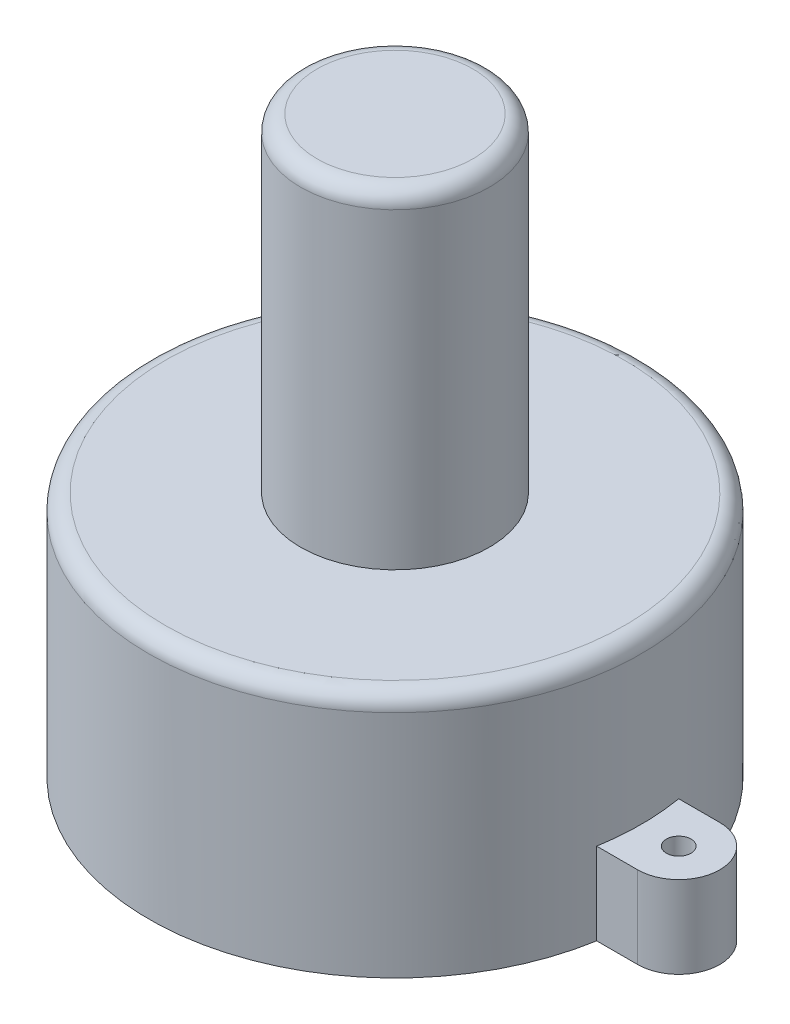
ISO-10303-21;
HEADER;
FILE_DESCRIPTION(('STEP AP214'),'2;1');
FILE_NAME('part.step','',(''),(''),'','','');
FILE_SCHEMA(('AUTOMOTIVE_DESIGN { 1 0 10303 214 1 1 1 1 }'));
ENDSEC;
DATA;
#1=APPLICATION_CONTEXT('core data for automotive mechanical design processes');
#2=APPLICATION_PROTOCOL_DEFINITION('international standard','automotive_design',2000,#1);
#3=PRODUCT_CONTEXT('',#1,'mechanical');
#4=PRODUCT('Part','Part','',(#3));
#5=PRODUCT_RELATED_PRODUCT_CATEGORY('part','',(#4));
#6=PRODUCT_DEFINITION_FORMATION('','',#4);
#7=PRODUCT_DEFINITION_CONTEXT('part definition',#1,'design');
#8=PRODUCT_DEFINITION('design','',#6,#7);
#9=PRODUCT_DEFINITION_SHAPE('','',#8);
#10=(LENGTH_UNIT() NAMED_UNIT(*) SI_UNIT(.MILLI.,.METRE.));
#11=(NAMED_UNIT(*) PLANE_ANGLE_UNIT() SI_UNIT($,.RADIAN.));
#12=(NAMED_UNIT(*) SI_UNIT($,.STERADIAN.) SOLID_ANGLE_UNIT());
#13=UNCERTAINTY_MEASURE_WITH_UNIT(LENGTH_MEASURE(1.E-05),#10,'distance_accuracy_value','');
#14=(GEOMETRIC_REPRESENTATION_CONTEXT(3) GLOBAL_UNCERTAINTY_ASSIGNED_CONTEXT((#13)) GLOBAL_UNIT_ASSIGNED_CONTEXT((#10,
#11,#12)) REPRESENTATION_CONTEXT('',''));
#15=CARTESIAN_POINT('',(0.,0.,0.));
#16=DIRECTION('',(0.,0.,1.));
#17=DIRECTION('',(1.,0.,0.));
#18=AXIS2_PLACEMENT_3D('',#15,#16,#17);
#19=CARTESIAN_POINT('',(34.5803989154981,0.,0.));
#20=DIRECTION('',(0.,-1.,0.));
#21=DIRECTION('',(0.,0.,-1.));
#22=AXIS2_PLACEMENT_3D('',#19,#20,#21);
#23=CYLINDRICAL_SURFACE('',#22,5.);
#24=DIRECTION('',(0.,-1.,0.));
#25=VECTOR('',#24,1.);
#26=CARTESIAN_POINT('',(34.5803989154981,10.,5.));
#27=LINE('',#26,#25);
#28=CARTESIAN_POINT('',(34.5803989154981,0.,5.));
#29=VERTEX_POINT('',#28);
#30=CARTESIAN_POINT('',(34.5803989154981,10.,5.));
#31=VERTEX_POINT('',#30);
#32=EDGE_CURVE('E171',#29,#31,#27,.F.);
#33=ORIENTED_EDGE('',*,*,#32,.F.);
#34=CARTESIAN_POINT('',(34.5803989154981,0.,0.));
#35=DIRECTION('',(0.,1.,0.));
#36=DIRECTION('',(0.,0.,1.));
#37=AXIS2_PLACEMENT_3D('',#34,#35,#36);
#38=CIRCLE('',#37,5.);
#39=CARTESIAN_POINT('',(34.5803989154981,0.,-5.));
#40=VERTEX_POINT('',#39);
#41=EDGE_CURVE('E59',#40,#29,#38,.F.);
#42=ORIENTED_EDGE('',*,*,#41,.F.);
#43=DIRECTION('',(0.,-1.,0.));
#44=VECTOR('',#43,1.);
#45=CARTESIAN_POINT('',(34.5803989154981,10.,-5.));
#46=LINE('',#45,#44);
#47=CARTESIAN_POINT('',(34.5803989154981,10.,-5.));
#48=VERTEX_POINT('',#47);
#49=EDGE_CURVE('E174',#48,#40,#46,.T.);
#50=ORIENTED_EDGE('',*,*,#49,.F.);
#51=CARTESIAN_POINT('',(34.5803989154981,10.,0.));
#52=DIRECTION('',(0.,-1.,0.));
#53=DIRECTION('',(0.,0.,-1.));
#54=AXIS2_PLACEMENT_3D('',#51,#52,#53);
#55=CIRCLE('',#54,5.);
#56=EDGE_CURVE('E52',#31,#48,#55,.F.);
#57=ORIENTED_EDGE('',*,*,#56,.F.);
#58=EDGE_LOOP('',(#33,#42,#50,#57));
#59=FACE_BOUND('',#58,.T.);
#60=ADVANCED_FACE('F37',(#59),#23,.T.);
#61=CARTESIAN_POINT('',(-34.5803989154981,10.,0.));
#62=DIRECTION('',(0.,-1.,0.));
#63=DIRECTION('',(0.,0.,-1.));
#64=AXIS2_PLACEMENT_3D('',#61,#62,#63);
#65=CYLINDRICAL_SURFACE('',#64,5.);
#66=DIRECTION('',(0.,-1.,0.));
#67=VECTOR('',#66,1.);
#68=CARTESIAN_POINT('',(-34.5803989154981,10.,5.));
#69=LINE('',#68,#67);
#70=CARTESIAN_POINT('',(-34.5803989154981,10.,5.));
#71=VERTEX_POINT('',#70);
#72=CARTESIAN_POINT('',(-34.5803989154981,0.,5.));
#73=VERTEX_POINT('',#72);
#74=EDGE_CURVE('E133',#71,#73,#69,.T.);
#75=ORIENTED_EDGE('',*,*,#74,.F.);
#76=CARTESIAN_POINT('',(-34.5803989154981,10.,0.));
#77=DIRECTION('',(0.,1.,0.));
#78=DIRECTION('',(0.,0.,1.));
#79=AXIS2_PLACEMENT_3D('',#76,#77,#78);
#80=CIRCLE('',#79,5.);
#81=CARTESIAN_POINT('',(-34.5803989154981,10.,-5.));
#82=VERTEX_POINT('',#81);
#83=EDGE_CURVE('E167',#82,#71,#80,.T.);
#84=ORIENTED_EDGE('',*,*,#83,.F.);
#85=DIRECTION('',(0.,-1.,0.));
#86=VECTOR('',#85,1.);
#87=CARTESIAN_POINT('',(-34.5803989154981,10.,-5.));
#88=LINE('',#87,#86);
#89=CARTESIAN_POINT('',(-34.5803989154981,0.,-5.));
#90=VERTEX_POINT('',#89);
#91=EDGE_CURVE('E164',#90,#82,#88,.F.);
#92=ORIENTED_EDGE('',*,*,#91,.F.);
#93=CARTESIAN_POINT('',(-34.5803989154981,0.,0.));
#94=DIRECTION('',(0.,1.,0.));
#95=DIRECTION('',(0.,0.,1.));
#96=AXIS2_PLACEMENT_3D('',#93,#94,#95);
#97=CIRCLE('',#96,5.);
#98=EDGE_CURVE('E169',#73,#90,#97,.F.);
#99=ORIENTED_EDGE('',*,*,#98,.F.);
#100=EDGE_LOOP('',(#75,#84,#92,#99));
#101=FACE_BOUND('',#100,.T.);
#102=ADVANCED_FACE('F199',(#101),#65,.T.);
#103=CARTESIAN_POINT('',(0.,30.,0.));
#104=DIRECTION('',(0.,-1.,0.));
#105=DIRECTION('',(0.,0.,-1.));
#106=AXIS2_PLACEMENT_3D('',#103,#104,#105);
#107=CYLINDRICAL_SURFACE('',#106,30.);
#108=CARTESIAN_POINT('',(0.,28.,0.));
#109=DIRECTION('',(0.,1.,0.));
#110=DIRECTION('',(0.,0.,1.));
#111=AXIS2_PLACEMENT_3D('',#108,#109,#110);
#112=CIRCLE('',#111,30.);
#113=CARTESIAN_POINT('',(0.,28.,30.));
#114=VERTEX_POINT('',#113);
#115=EDGE_CURVE('E11',#114,#114,#112,.F.);
#116=ORIENTED_EDGE('',*,*,#115,.T.);
#117=EDGE_LOOP('',(#116));
#118=FACE_BOUND('',#117,.T.);
#119=CARTESIAN_POINT('',(0.,0.,0.));
#120=DIRECTION('',(0.,1.,0.));
#121=DIRECTION('',(0.,0.,1.));
#122=AXIS2_PLACEMENT_3D('',#119,#120,#121);
#123=CIRCLE('',#122,30.);
#124=CARTESIAN_POINT('',(29.5803989154981,0.,-5.));
#125=VERTEX_POINT('',#124);
#126=CARTESIAN_POINT('',(-29.5803989154981,0.,-5.));
#127=VERTEX_POINT('',#126);
#128=EDGE_CURVE('E114',#125,#127,#123,.T.);
#129=ORIENTED_EDGE('',*,*,#128,.T.);
#130=DIRECTION('',(0.,-1.,0.));
#131=VECTOR('',#130,1.);
#132=CARTESIAN_POINT('',(-29.5803989154981,10.,-5.));
#133=LINE('',#132,#131);
#134=CARTESIAN_POINT('',(-29.5803989154981,10.,-5.));
#135=VERTEX_POINT('',#134);
#136=EDGE_CURVE('E127',#135,#127,#133,.T.);
#137=ORIENTED_EDGE('',*,*,#136,.F.);
#138=CARTESIAN_POINT('',(0.,10.,0.));
#139=DIRECTION('',(0.,1.,0.));
#140=DIRECTION('',(0.,0.,1.));
#141=AXIS2_PLACEMENT_3D('',#138,#139,#140);
#142=CIRCLE('',#141,30.);
#143=CARTESIAN_POINT('',(-29.5803989154981,10.,5.));
#144=VERTEX_POINT('',#143);
#145=EDGE_CURVE('E123',#135,#144,#142,.T.);
#146=ORIENTED_EDGE('',*,*,#145,.T.);
#147=DIRECTION('',(0.,-1.,0.));
#148=VECTOR('',#147,1.);
#149=CARTESIAN_POINT('',(-29.5803989154981,10.,5.));
#150=LINE('',#149,#148);
#151=CARTESIAN_POINT('',(-29.5803989154981,0.,5.));
#152=VERTEX_POINT('',#151);
#153=EDGE_CURVE('E118',#144,#152,#150,.T.);
#154=ORIENTED_EDGE('',*,*,#153,.T.);
#155=CARTESIAN_POINT('',(29.5803989154981,0.,5.));
#156=VERTEX_POINT('',#155);
#157=EDGE_CURVE('E103',#152,#156,#123,.T.);
#158=ORIENTED_EDGE('',*,*,#157,.T.);
#159=DIRECTION('',(0.,-1.,0.));
#160=VECTOR('',#159,1.);
#161=CARTESIAN_POINT('',(29.5803989154981,10.,5.));
#162=LINE('',#161,#160);
#163=CARTESIAN_POINT('',(29.5803989154981,10.,5.));
#164=VERTEX_POINT('',#163);
#165=EDGE_CURVE('E154',#164,#156,#162,.T.);
#166=ORIENTED_EDGE('',*,*,#165,.F.);
#167=CARTESIAN_POINT('',(0.,10.,0.));
#168=DIRECTION('',(0.,1.,0.));
#169=DIRECTION('',(0.,0.,-1.));
#170=AXIS2_PLACEMENT_3D('',#167,#168,#169);
#171=CIRCLE('',#170,30.);
#172=CARTESIAN_POINT('',(29.5803989154981,10.,-5.));
#173=VERTEX_POINT('',#172);
#174=EDGE_CURVE('E152',#164,#173,#171,.T.);
#175=ORIENTED_EDGE('',*,*,#174,.T.);
#176=DIRECTION('',(0.,-1.,0.));
#177=VECTOR('',#176,1.);
#178=CARTESIAN_POINT('',(29.5803989154981,10.,-5.));
#179=LINE('',#178,#177);
#180=EDGE_CURVE('E157',#173,#125,#179,.T.);
#181=ORIENTED_EDGE('',*,*,#180,.T.);
#182=EDGE_LOOP('',(#129,#137,#146,#154,#158,#166,#175,#181));
#183=FACE_BOUND('',#182,.T.);
#184=ADVANCED_FACE('F120',(#118,#183),#107,.T.);
#185=CARTESIAN_POINT('',(0.,30.,0.));
#186=DIRECTION('',(0.,1.,0.));
#187=DIRECTION('',(0.,0.,1.));
#188=AXIS2_PLACEMENT_3D('',#185,#186,#187);
#189=PLANE('',#188);
#190=CARTESIAN_POINT('',(0.,30.,0.));
#191=DIRECTION('',(0.,1.,0.));
#192=DIRECTION('',(0.,0.,1.));
#193=AXIS2_PLACEMENT_3D('',#190,#191,#192);
#194=CIRCLE('',#193,28.);
#195=CARTESIAN_POINT('',(0.,30.,28.));
#196=VERTEX_POINT('',#195);
#197=EDGE_CURVE('E45',#196,#196,#194,.T.);
#198=ORIENTED_EDGE('',*,*,#197,.T.);
#199=EDGE_LOOP('',(#198));
#200=FACE_BOUND('',#199,.T.);
#201=CARTESIAN_POINT('',(0.,30.,0.));
#202=DIRECTION('',(0.,1.,0.));
#203=DIRECTION('',(0.,0.,1.));
#204=AXIS2_PLACEMENT_3D('',#201,#202,#203);
#205=CIRCLE('',#204,11.5);
#206=CARTESIAN_POINT('',(0.,30.,11.5));
#207=VERTEX_POINT('',#206);
#208=EDGE_CURVE('E115',#207,#207,#205,.F.);
#209=ORIENTED_EDGE('',*,*,#208,.T.);
#210=EDGE_LOOP('',(#209));
#211=FACE_BOUND('',#210,.T.);
#212=ADVANCED_FACE('F186',(#200,#211),#189,.T.);
#213=CARTESIAN_POINT('',(0.,0.,0.));
#214=DIRECTION('',(0.,1.,0.));
#215=DIRECTION('',(0.,0.,1.));
#216=AXIS2_PLACEMENT_3D('',#213,#214,#215);
#217=PLANE('',#216);
#218=CARTESIAN_POINT('',(34.5803989154981,0.,0.));
#219=DIRECTION('',(0.,1.,0.));
#220=DIRECTION('',(0.,0.,1.));
#221=AXIS2_PLACEMENT_3D('',#218,#219,#220);
#222=CIRCLE('',#221,1.5);
#223=CARTESIAN_POINT('',(34.5803989154981,0.,1.5));
#224=VERTEX_POINT('',#223);
#225=EDGE_CURVE('E135',#224,#224,#222,.T.);
#226=ORIENTED_EDGE('',*,*,#225,.T.);
#227=EDGE_LOOP('',(#226));
#228=FACE_BOUND('',#227,.T.);
#229=CARTESIAN_POINT('',(-34.5803989154981,0.,0.));
#230=DIRECTION('',(0.,1.,0.));
#231=DIRECTION('',(0.,0.,1.));
#232=AXIS2_PLACEMENT_3D('',#229,#230,#231);
#233=CIRCLE('',#232,1.5);
#234=CARTESIAN_POINT('',(-34.5803989154981,0.,1.5));
#235=VERTEX_POINT('',#234);
#236=EDGE_CURVE('E263',#235,#235,#233,.T.);
#237=ORIENTED_EDGE('',*,*,#236,.T.);
#238=EDGE_LOOP('',(#237));
#239=FACE_BOUND('',#238,.T.);
#240=DIRECTION('',(1.,0.,0.));
#241=VECTOR('',#240,1.);
#242=CARTESIAN_POINT('',(29.5803989154981,0.,-5.));
#243=LINE('',#242,#241);
#244=EDGE_CURVE('E145',#125,#40,#243,.T.);
#245=ORIENTED_EDGE('',*,*,#244,.T.);
#246=ORIENTED_EDGE('',*,*,#41,.T.);
#247=DIRECTION('',(-1.,0.,0.));
#248=VECTOR('',#247,1.);
#249=CARTESIAN_POINT('',(29.5803989154981,0.,5.));
#250=LINE('',#249,#248);
#251=EDGE_CURVE('E110',#29,#156,#250,.T.);
#252=ORIENTED_EDGE('',*,*,#251,.T.);
#253=ORIENTED_EDGE('',*,*,#157,.F.);
#254=DIRECTION('',(-1.,0.,0.));
#255=VECTOR('',#254,1.);
#256=CARTESIAN_POINT('',(-29.5803989154981,0.,5.));
#257=LINE('',#256,#255);
#258=EDGE_CURVE('E108',#152,#73,#257,.T.);
#259=ORIENTED_EDGE('',*,*,#258,.T.);
#260=ORIENTED_EDGE('',*,*,#98,.T.);
#261=DIRECTION('',(1.,0.,0.));
#262=VECTOR('',#261,1.);
#263=CARTESIAN_POINT('',(-29.5803989154981,0.,-5.));
#264=LINE('',#263,#262);
#265=EDGE_CURVE('E134',#90,#127,#264,.T.);
#266=ORIENTED_EDGE('',*,*,#265,.T.);
#267=ORIENTED_EDGE('',*,*,#128,.F.);
#268=EDGE_LOOP('',(#245,#246,#252,#253,#259,#260,#266,#267));
#269=FACE_BOUND('',#268,.T.);
#270=ADVANCED_FACE('F106',(#228,#239,#269),#217,.F.);
#271=CARTESIAN_POINT('',(0.,70.,0.));
#272=DIRECTION('',(0.,-1.,0.));
#273=DIRECTION('',(0.,0.,-1.));
#274=AXIS2_PLACEMENT_3D('',#271,#272,#273);
#275=CYLINDRICAL_SURFACE('',#274,11.5);
#276=CARTESIAN_POINT('',(0.,68.,0.));
#277=DIRECTION('',(0.,1.,0.));
#278=DIRECTION('',(0.,0.,1.));
#279=AXIS2_PLACEMENT_3D('',#276,#277,#278);
#280=CIRCLE('',#279,11.5);
#281=CARTESIAN_POINT('',(0.,68.,11.5));
#282=VERTEX_POINT('',#281);
#283=EDGE_CURVE('E181',#282,#282,#280,.F.);
#284=ORIENTED_EDGE('',*,*,#283,.T.);
#285=EDGE_LOOP('',(#284));
#286=FACE_BOUND('',#285,.T.);
#287=ORIENTED_EDGE('',*,*,#208,.F.);
#288=EDGE_LOOP('',(#287));
#289=FACE_BOUND('',#288,.T.);
#290=ADVANCED_FACE('F218',(#286,#289),#275,.T.);
#291=CARTESIAN_POINT('',(0.,70.,0.));
#292=DIRECTION('',(0.,1.,0.));
#293=DIRECTION('',(0.,0.,1.));
#294=AXIS2_PLACEMENT_3D('',#291,#292,#293);
#295=PLANE('',#294);
#296=CARTESIAN_POINT('',(0.,70.,0.));
#297=DIRECTION('',(0.,1.,0.));
#298=DIRECTION('',(0.,0.,1.));
#299=AXIS2_PLACEMENT_3D('',#296,#297,#298);
#300=CIRCLE('',#299,9.5);
#301=CARTESIAN_POINT('',(0.,70.,9.5));
#302=VERTEX_POINT('',#301);
#303=EDGE_CURVE('E178',#302,#302,#300,.T.);
#304=ORIENTED_EDGE('',*,*,#303,.T.);
#305=EDGE_LOOP('',(#304));
#306=FACE_BOUND('',#305,.T.);
#307=ADVANCED_FACE('F224',(#306),#295,.T.);
#308=CARTESIAN_POINT('',(29.5803989154981,10.,-5.));
#309=DIRECTION('',(0.,0.,-1.));
#310=DIRECTION('',(-1.,0.,0.));
#311=AXIS2_PLACEMENT_3D('',#308,#309,#310);
#312=PLANE('',#311);
#313=DIRECTION('',(1.,0.,0.));
#314=VECTOR('',#313,1.);
#315=CARTESIAN_POINT('',(29.5803989154981,10.,-5.));
#316=LINE('',#315,#314);
#317=EDGE_CURVE('E147',#173,#48,#316,.T.);
#318=ORIENTED_EDGE('',*,*,#317,.T.);
#319=ORIENTED_EDGE('',*,*,#49,.T.);
#320=ORIENTED_EDGE('',*,*,#244,.F.);
#321=ORIENTED_EDGE('',*,*,#180,.F.);
#322=EDGE_LOOP('',(#318,#319,#320,#321));
#323=FACE_BOUND('',#322,.T.);
#324=ADVANCED_FACE('F228',(#323),#312,.T.);
#325=CARTESIAN_POINT('',(29.5803989154981,10.,5.));
#326=DIRECTION('',(0.,0.,1.));
#327=DIRECTION('',(1.,0.,0.));
#328=AXIS2_PLACEMENT_3D('',#325,#326,#327);
#329=PLANE('',#328);
#330=ORIENTED_EDGE('',*,*,#251,.F.);
#331=ORIENTED_EDGE('',*,*,#32,.T.);
#332=DIRECTION('',(-1.,0.,0.));
#333=VECTOR('',#332,1.);
#334=CARTESIAN_POINT('',(29.5803989154981,10.,5.));
#335=LINE('',#334,#333);
#336=EDGE_CURVE('E150',#31,#164,#335,.T.);
#337=ORIENTED_EDGE('',*,*,#336,.T.);
#338=ORIENTED_EDGE('',*,*,#165,.T.);
#339=EDGE_LOOP('',(#330,#331,#337,#338));
#340=FACE_BOUND('',#339,.T.);
#341=ADVANCED_FACE('F232',(#340),#329,.T.);
#342=CARTESIAN_POINT('',(0.,10.,0.));
#343=DIRECTION('',(0.,-1.,0.));
#344=DIRECTION('',(0.,0.,-1.));
#345=AXIS2_PLACEMENT_3D('',#342,#343,#344);
#346=PLANE('',#345);
#347=CARTESIAN_POINT('',(34.5803989154981,10.,0.));
#348=DIRECTION('',(0.,1.,0.));
#349=DIRECTION('',(0.,0.,1.));
#350=AXIS2_PLACEMENT_3D('',#347,#348,#349);
#351=CIRCLE('',#350,1.5);
#352=CARTESIAN_POINT('',(34.5803989154981,10.,1.5));
#353=VERTEX_POINT('',#352);
#354=EDGE_CURVE('E139',#353,#353,#351,.T.);
#355=ORIENTED_EDGE('',*,*,#354,.F.);
#356=EDGE_LOOP('',(#355));
#357=FACE_BOUND('',#356,.T.);
#358=ORIENTED_EDGE('',*,*,#336,.F.);
#359=ORIENTED_EDGE('',*,*,#56,.T.);
#360=ORIENTED_EDGE('',*,*,#317,.F.);
#361=ORIENTED_EDGE('',*,*,#174,.F.);
#362=EDGE_LOOP('',(#358,#359,#360,#361));
#363=FACE_BOUND('',#362,.T.);
#364=ADVANCED_FACE('F236',(#357,#363),#346,.F.);
#365=CARTESIAN_POINT('',(-29.5803989154981,10.,-5.));
#366=DIRECTION('',(0.,0.,-1.));
#367=DIRECTION('',(-1.,0.,0.));
#368=AXIS2_PLACEMENT_3D('',#365,#366,#367);
#369=PLANE('',#368);
#370=ORIENTED_EDGE('',*,*,#265,.F.);
#371=ORIENTED_EDGE('',*,*,#91,.T.);
#372=DIRECTION('',(1.,0.,0.));
#373=VECTOR('',#372,1.);
#374=CARTESIAN_POINT('',(-29.5803989154981,10.,-5.));
#375=LINE('',#374,#373);
#376=EDGE_CURVE('E128',#82,#135,#375,.T.);
#377=ORIENTED_EDGE('',*,*,#376,.T.);
#378=ORIENTED_EDGE('',*,*,#136,.T.);
#379=EDGE_LOOP('',(#370,#371,#377,#378));
#380=FACE_BOUND('',#379,.T.);
#381=ADVANCED_FACE('F240',(#380),#369,.T.);
#382=CARTESIAN_POINT('',(-29.5803989154981,10.,5.));
#383=DIRECTION('',(0.,0.,1.));
#384=DIRECTION('',(1.,0.,0.));
#385=AXIS2_PLACEMENT_3D('',#382,#383,#384);
#386=PLANE('',#385);
#387=DIRECTION('',(-1.,0.,0.));
#388=VECTOR('',#387,1.);
#389=CARTESIAN_POINT('',(-29.5803989154981,10.,5.));
#390=LINE('',#389,#388);
#391=EDGE_CURVE('E271',#144,#71,#390,.T.);
#392=ORIENTED_EDGE('',*,*,#391,.T.);
#393=ORIENTED_EDGE('',*,*,#74,.T.);
#394=ORIENTED_EDGE('',*,*,#258,.F.);
#395=ORIENTED_EDGE('',*,*,#153,.F.);
#396=EDGE_LOOP('',(#392,#393,#394,#395));
#397=FACE_BOUND('',#396,.T.);
#398=ADVANCED_FACE('F131',(#397),#386,.T.);
#399=CARTESIAN_POINT('',(0.,10.,0.));
#400=DIRECTION('',(0.,1.,0.));
#401=DIRECTION('',(0.,0.,1.));
#402=AXIS2_PLACEMENT_3D('',#399,#400,#401);
#403=PLANE('',#402);
#404=CARTESIAN_POINT('',(-34.5803989154981,10.,0.));
#405=DIRECTION('',(0.,1.,0.));
#406=DIRECTION('',(0.,0.,1.));
#407=AXIS2_PLACEMENT_3D('',#404,#405,#406);
#408=CIRCLE('',#407,1.5);
#409=CARTESIAN_POINT('',(-34.5803989154981,10.,1.5));
#410=VERTEX_POINT('',#409);
#411=EDGE_CURVE('E266',#410,#410,#408,.T.);
#412=ORIENTED_EDGE('',*,*,#411,.F.);
#413=EDGE_LOOP('',(#412));
#414=FACE_BOUND('',#413,.T.);
#415=ORIENTED_EDGE('',*,*,#376,.F.);
#416=ORIENTED_EDGE('',*,*,#83,.T.);
#417=ORIENTED_EDGE('',*,*,#391,.F.);
#418=ORIENTED_EDGE('',*,*,#145,.F.);
#419=EDGE_LOOP('',(#415,#416,#417,#418));
#420=FACE_BOUND('',#419,.T.);
#421=ADVANCED_FACE('F244',(#414,#420),#403,.T.);
#422=CARTESIAN_POINT('',(-34.5803989154981,0.,0.));
#423=DIRECTION('',(0.,1.,0.));
#424=DIRECTION('',(0.,0.,1.));
#425=AXIS2_PLACEMENT_3D('',#422,#423,#424);
#426=CYLINDRICAL_SURFACE('',#425,1.5);
#427=ORIENTED_EDGE('',*,*,#236,.F.);
#428=EDGE_LOOP('',(#427));
#429=FACE_BOUND('',#428,.T.);
#430=ORIENTED_EDGE('',*,*,#411,.T.);
#431=EDGE_LOOP('',(#430));
#432=FACE_BOUND('',#431,.T.);
#433=ADVANCED_FACE('F250',(#429,#432),#426,.F.);
#434=CARTESIAN_POINT('',(34.5803989154981,0.,0.));
#435=DIRECTION('',(0.,1.,0.));
#436=DIRECTION('',(0.,0.,1.));
#437=AXIS2_PLACEMENT_3D('',#434,#435,#436);
#438=CYLINDRICAL_SURFACE('',#437,1.5);
#439=ORIENTED_EDGE('',*,*,#225,.F.);
#440=EDGE_LOOP('',(#439));
#441=FACE_BOUND('',#440,.T.);
#442=ORIENTED_EDGE('',*,*,#354,.T.);
#443=EDGE_LOOP('',(#442));
#444=FACE_BOUND('',#443,.T.);
#445=ADVANCED_FACE('F195',(#441,#444),#438,.F.);
#446=CARTESIAN_POINT('',(0.,68.,0.));
#447=DIRECTION('',(0.,1.,0.));
#448=DIRECTION('',(0.,0.,1.));
#449=AXIS2_PLACEMENT_3D('',#446,#447,#448);
#450=TOROIDAL_SURFACE('',#449,9.5,2.);
#451=ORIENTED_EDGE('',*,*,#283,.F.);
#452=EDGE_LOOP('',(#451));
#453=FACE_BOUND('',#452,.T.);
#454=ORIENTED_EDGE('',*,*,#303,.F.);
#455=EDGE_LOOP('',(#454));
#456=FACE_BOUND('',#455,.T.);
#457=ADVANCED_FACE('F190',(#453,#456),#450,.T.);
#458=CARTESIAN_POINT('',(0.,28.,0.));
#459=DIRECTION('',(0.,1.,0.));
#460=DIRECTION('',(0.,0.,1.));
#461=AXIS2_PLACEMENT_3D('',#458,#459,#460);
#462=TOROIDAL_SURFACE('',#461,28.,2.);
#463=ORIENTED_EDGE('',*,*,#115,.F.);
#464=EDGE_LOOP('',(#463));
#465=FACE_BOUND('',#464,.T.);
#466=ORIENTED_EDGE('',*,*,#197,.F.);
#467=EDGE_LOOP('',(#466));
#468=FACE_BOUND('',#467,.T.);
#469=ADVANCED_FACE('F39',(#465,#468),#462,.T.);
#470=CLOSED_SHELL('',(#60,#102,#184,#212,#270,#290,#307,#324,#341,#364,#381,#398,#421,#433,#445,
#457,#469));
#471=MANIFOLD_SOLID_BREP('B2',#470);
#472=ADVANCED_BREP_SHAPE_REPRESENTATION('',(#18,#471),#14);
#473=SHAPE_DEFINITION_REPRESENTATION(#9,#472);
ENDSEC;
END-ISO-10303-21;
